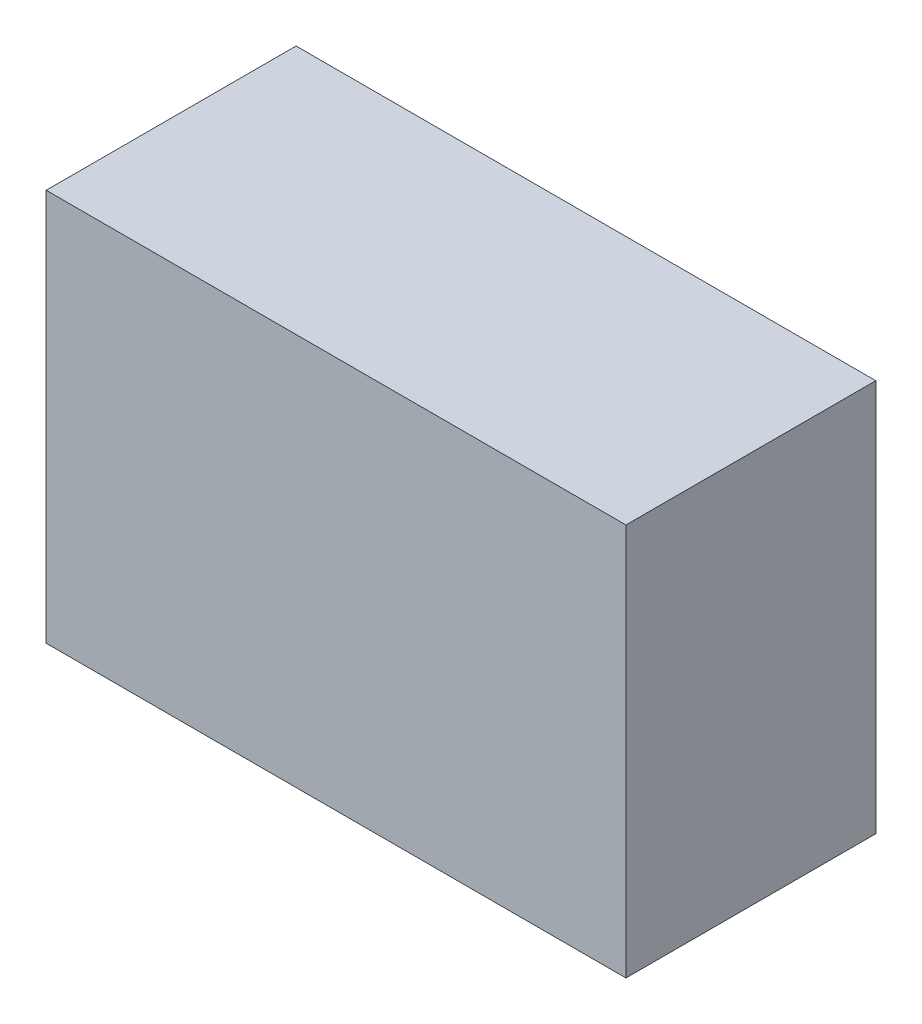
ISO-10303-21;
HEADER;
FILE_DESCRIPTION(('STEP AP214'),'2;1');
FILE_NAME('part.step','',(''),(''),'','','');
FILE_SCHEMA(('AUTOMOTIVE_DESIGN { 1 0 10303 214 1 1 1 1 }'));
ENDSEC;
DATA;
#1=APPLICATION_CONTEXT('core data for automotive mechanical design processes');
#2=APPLICATION_PROTOCOL_DEFINITION('international standard','automotive_design',2000,#1);
#3=PRODUCT_CONTEXT('',#1,'mechanical');
#4=PRODUCT('Part','Part','',(#3));
#5=PRODUCT_RELATED_PRODUCT_CATEGORY('part','',(#4));
#6=PRODUCT_DEFINITION_FORMATION('','',#4);
#7=PRODUCT_DEFINITION_CONTEXT('part definition',#1,'design');
#8=PRODUCT_DEFINITION('design','',#6,#7);
#9=PRODUCT_DEFINITION_SHAPE('','',#8);
#10=(LENGTH_UNIT() NAMED_UNIT(*) SI_UNIT(.MILLI.,.METRE.));
#11=(NAMED_UNIT(*) PLANE_ANGLE_UNIT() SI_UNIT($,.RADIAN.));
#12=(NAMED_UNIT(*) SI_UNIT($,.STERADIAN.) SOLID_ANGLE_UNIT());
#13=UNCERTAINTY_MEASURE_WITH_UNIT(LENGTH_MEASURE(1.E-05),#10,'distance_accuracy_value','');
#14=(GEOMETRIC_REPRESENTATION_CONTEXT(3) GLOBAL_UNCERTAINTY_ASSIGNED_CONTEXT((#13)) GLOBAL_UNIT_ASSIGNED_CONTEXT((#10,
#11,#12)) REPRESENTATION_CONTEXT('',''));
#15=CARTESIAN_POINT('',(0.,0.,0.));
#16=DIRECTION('',(0.,0.,1.));
#17=DIRECTION('',(1.,0.,0.));
#18=AXIS2_PLACEMENT_3D('',#15,#16,#17);
#19=CARTESIAN_POINT('',(75.438,102.108,32.512));
#20=DIRECTION('',(-1.,0.,0.));
#21=DIRECTION('',(0.,0.,1.));
#22=AXIS2_PLACEMENT_3D('',#19,#20,#21);
#23=PLANE('',#22);
#24=DIRECTION('',(0.,0.,-1.));
#25=VECTOR('',#24,1.);
#26=CARTESIAN_POINT('',(75.438,0.,32.512));
#27=LINE('',#26,#25);
#28=CARTESIAN_POINT('',(75.438,0.,32.512));
#29=VERTEX_POINT('',#28);
#30=CARTESIAN_POINT('',(75.438,0.,-32.512));
#31=VERTEX_POINT('',#30);
#32=EDGE_CURVE('E113',#29,#31,#27,.T.);
#33=ORIENTED_EDGE('',*,*,#32,.T.);
#34=DIRECTION('',(0.,-1.,0.));
#35=VECTOR('',#34,1.);
#36=CARTESIAN_POINT('',(75.438,102.108,-32.512));
#37=LINE('',#36,#35);
#38=CARTESIAN_POINT('',(75.438,102.108,-32.512));
#39=VERTEX_POINT('',#38);
#40=EDGE_CURVE('E11',#39,#31,#37,.T.);
#41=ORIENTED_EDGE('',*,*,#40,.F.);
#42=DIRECTION('',(0.,0.,-1.));
#43=VECTOR('',#42,1.);
#44=CARTESIAN_POINT('',(75.438,102.108,32.512));
#45=LINE('',#44,#43);
#46=CARTESIAN_POINT('',(75.438,102.108,32.512));
#47=VERTEX_POINT('',#46);
#48=EDGE_CURVE('E97',#47,#39,#45,.T.);
#49=ORIENTED_EDGE('',*,*,#48,.F.);
#50=DIRECTION('',(0.,-1.,0.));
#51=VECTOR('',#50,1.);
#52=CARTESIAN_POINT('',(75.438,102.108,32.512));
#53=LINE('',#52,#51);
#54=EDGE_CURVE('E109',#47,#29,#53,.T.);
#55=ORIENTED_EDGE('',*,*,#54,.T.);
#56=EDGE_LOOP('',(#33,#41,#49,#55));
#57=FACE_BOUND('',#56,.T.);
#58=ADVANCED_FACE('F45',(#57),#23,.F.);
#59=CARTESIAN_POINT('',(-75.438,102.108,-32.512));
#60=DIRECTION('',(0.,0.,1.));
#61=DIRECTION('',(1.,0.,0.));
#62=AXIS2_PLACEMENT_3D('',#59,#60,#61);
#63=PLANE('',#62);
#64=DIRECTION('',(-1.,0.,0.));
#65=VECTOR('',#64,1.);
#66=CARTESIAN_POINT('',(-75.438,0.,-32.512));
#67=LINE('',#66,#65);
#68=CARTESIAN_POINT('',(-75.438,0.,-32.512));
#69=VERTEX_POINT('',#68);
#70=EDGE_CURVE('E102',#31,#69,#67,.T.);
#71=ORIENTED_EDGE('',*,*,#70,.T.);
#72=DIRECTION('',(0.,-1.,0.));
#73=VECTOR('',#72,1.);
#74=CARTESIAN_POINT('',(-75.438,102.108,-32.512));
#75=LINE('',#74,#73);
#76=CARTESIAN_POINT('',(-75.438,102.108,-32.512));
#77=VERTEX_POINT('',#76);
#78=EDGE_CURVE('E54',#77,#69,#75,.T.);
#79=ORIENTED_EDGE('',*,*,#78,.F.);
#80=DIRECTION('',(-1.,0.,0.));
#81=VECTOR('',#80,1.);
#82=CARTESIAN_POINT('',(-75.438,102.108,-32.512));
#83=LINE('',#82,#81);
#84=EDGE_CURVE('E92',#39,#77,#83,.T.);
#85=ORIENTED_EDGE('',*,*,#84,.F.);
#86=ORIENTED_EDGE('',*,*,#40,.T.);
#87=EDGE_LOOP('',(#71,#79,#85,#86));
#88=FACE_BOUND('',#87,.T.);
#89=ADVANCED_FACE('F101',(#88),#63,.F.);
#90=CARTESIAN_POINT('',(-75.438,102.108,32.512));
#91=DIRECTION('',(1.,0.,0.));
#92=DIRECTION('',(0.,0.,-1.));
#93=AXIS2_PLACEMENT_3D('',#90,#91,#92);
#94=PLANE('',#93);
#95=DIRECTION('',(0.,0.,1.));
#96=VECTOR('',#95,1.);
#97=CARTESIAN_POINT('',(-75.438,0.,32.512));
#98=LINE('',#97,#96);
#99=CARTESIAN_POINT('',(-75.438,0.,32.512));
#100=VERTEX_POINT('',#99);
#101=EDGE_CURVE('E79',#69,#100,#98,.T.);
#102=ORIENTED_EDGE('',*,*,#101,.T.);
#103=DIRECTION('',(0.,-1.,0.));
#104=VECTOR('',#103,1.);
#105=CARTESIAN_POINT('',(-75.438,102.108,32.512));
#106=LINE('',#105,#104);
#107=CARTESIAN_POINT('',(-75.438,102.108,32.512));
#108=VERTEX_POINT('',#107);
#109=EDGE_CURVE('E104',#108,#100,#106,.T.);
#110=ORIENTED_EDGE('',*,*,#109,.F.);
#111=DIRECTION('',(0.,0.,1.));
#112=VECTOR('',#111,1.);
#113=CARTESIAN_POINT('',(-75.438,102.108,32.512));
#114=LINE('',#113,#112);
#115=EDGE_CURVE('E95',#77,#108,#114,.T.);
#116=ORIENTED_EDGE('',*,*,#115,.F.);
#117=ORIENTED_EDGE('',*,*,#78,.T.);
#118=EDGE_LOOP('',(#102,#110,#116,#117));
#119=FACE_BOUND('',#118,.T.);
#120=ADVANCED_FACE('F105',(#119),#94,.F.);
#121=CARTESIAN_POINT('',(-75.438,102.108,32.512));
#122=DIRECTION('',(0.,0.,-1.));
#123=DIRECTION('',(-1.,0.,0.));
#124=AXIS2_PLACEMENT_3D('',#121,#122,#123);
#125=PLANE('',#124);
#126=DIRECTION('',(1.,0.,0.));
#127=VECTOR('',#126,1.);
#128=CARTESIAN_POINT('',(-75.438,0.,32.512));
#129=LINE('',#128,#127);
#130=EDGE_CURVE('E85',#100,#29,#129,.T.);
#131=ORIENTED_EDGE('',*,*,#130,.T.);
#132=ORIENTED_EDGE('',*,*,#54,.F.);
#133=DIRECTION('',(1.,0.,0.));
#134=VECTOR('',#133,1.);
#135=CARTESIAN_POINT('',(-75.438,102.108,32.512));
#136=LINE('',#135,#134);
#137=EDGE_CURVE('E62',#108,#47,#136,.T.);
#138=ORIENTED_EDGE('',*,*,#137,.F.);
#139=ORIENTED_EDGE('',*,*,#109,.T.);
#140=EDGE_LOOP('',(#131,#132,#138,#139));
#141=FACE_BOUND('',#140,.T.);
#142=ADVANCED_FACE('F126',(#141),#125,.F.);
#143=CARTESIAN_POINT('',(0.,102.108,0.));
#144=DIRECTION('',(0.,-1.,0.));
#145=DIRECTION('',(0.,0.,-1.));
#146=AXIS2_PLACEMENT_3D('',#143,#144,#145);
#147=PLANE('',#146);
#148=ORIENTED_EDGE('',*,*,#48,.T.);
#149=ORIENTED_EDGE('',*,*,#84,.T.);
#150=ORIENTED_EDGE('',*,*,#115,.T.);
#151=ORIENTED_EDGE('',*,*,#137,.T.);
#152=EDGE_LOOP('',(#148,#149,#150,#151));
#153=FACE_BOUND('',#152,.T.);
#154=ADVANCED_FACE('F93',(#153),#147,.F.);
#155=CARTESIAN_POINT('',(0.,0.,0.));
#156=DIRECTION('',(0.,-1.,0.));
#157=DIRECTION('',(0.,0.,-1.));
#158=AXIS2_PLACEMENT_3D('',#155,#156,#157);
#159=PLANE('',#158);
#160=ORIENTED_EDGE('',*,*,#32,.F.);
#161=ORIENTED_EDGE('',*,*,#130,.F.);
#162=ORIENTED_EDGE('',*,*,#101,.F.);
#163=ORIENTED_EDGE('',*,*,#70,.F.);
#164=EDGE_LOOP('',(#160,#161,#162,#163));
#165=FACE_BOUND('',#164,.T.);
#166=ADVANCED_FACE('F129',(#165),#159,.T.);
#167=CLOSED_SHELL('',(#58,#89,#120,#142,#154,#166));
#168=MANIFOLD_SOLID_BREP('B2',#167);
#169=ADVANCED_BREP_SHAPE_REPRESENTATION('',(#18,#168),#14);
#170=SHAPE_DEFINITION_REPRESENTATION(#9,#169);
ENDSEC;
END-ISO-10303-21;
